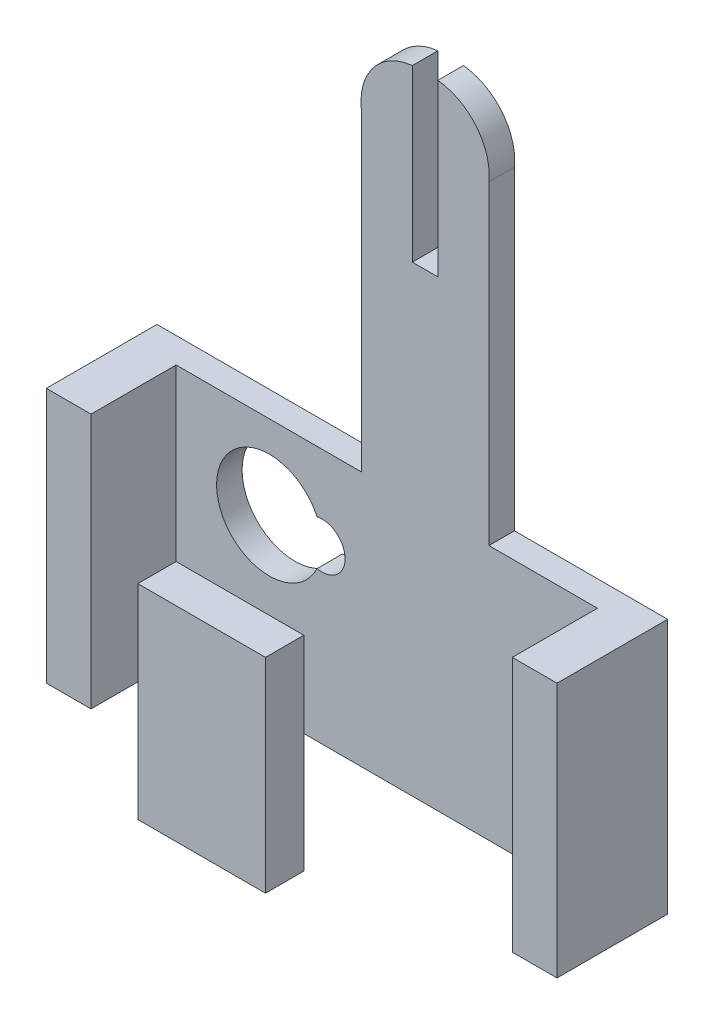
ISO-10303-21;
HEADER;
FILE_DESCRIPTION(('STEP AP214'),'2;1');
FILE_NAME('part.step','',(''),(''),'','','');
FILE_SCHEMA(('AUTOMOTIVE_DESIGN { 1 0 10303 214 1 1 1 1 }'));
ENDSEC;
DATA;
#1=APPLICATION_CONTEXT('core data for automotive mechanical design processes');
#2=APPLICATION_PROTOCOL_DEFINITION('international standard','automotive_design',2000,#1);
#3=PRODUCT_CONTEXT('',#1,'mechanical');
#4=PRODUCT('Part','Part','',(#3));
#5=PRODUCT_RELATED_PRODUCT_CATEGORY('part','',(#4));
#6=PRODUCT_DEFINITION_FORMATION('','',#4);
#7=PRODUCT_DEFINITION_CONTEXT('part definition',#1,'design');
#8=PRODUCT_DEFINITION('design','',#6,#7);
#9=PRODUCT_DEFINITION_SHAPE('','',#8);
#10=(LENGTH_UNIT() NAMED_UNIT(*) SI_UNIT(.MILLI.,.METRE.));
#11=(NAMED_UNIT(*) PLANE_ANGLE_UNIT() SI_UNIT($,.RADIAN.));
#12=(NAMED_UNIT(*) SI_UNIT($,.STERADIAN.) SOLID_ANGLE_UNIT());
#13=UNCERTAINTY_MEASURE_WITH_UNIT(LENGTH_MEASURE(1.E-05),#10,'distance_accuracy_value','');
#14=(GEOMETRIC_REPRESENTATION_CONTEXT(3) GLOBAL_UNCERTAINTY_ASSIGNED_CONTEXT((#13)) GLOBAL_UNIT_ASSIGNED_CONTEXT((#10,
#11,#12)) REPRESENTATION_CONTEXT('',''));
#15=CARTESIAN_POINT('',(0.,0.,0.));
#16=DIRECTION('',(0.,0.,1.));
#17=DIRECTION('',(1.,0.,0.));
#18=AXIS2_PLACEMENT_3D('',#15,#16,#17);
#19=CARTESIAN_POINT('',(0.830000000000001,13.33,3.));
#20=DIRECTION('',(0.,0.,-1.));
#21=DIRECTION('',(-1.,0.,0.));
#22=AXIS2_PLACEMENT_3D('',#19,#20,#21);
#23=PLANE('',#22);
#24=CARTESIAN_POINT('',(-12.1,-34.14,3.));
#25=DIRECTION('',(0.,0.,1.));
#26=DIRECTION('',(1.,0.,0.));
#27=AXIS2_PLACEMENT_3D('',#24,#25,#26);
#28=CIRCLE('',#27,2.7);
#29=CARTESIAN_POINT('',(-12.6879032258064,-36.7752172200952,3.));
#30=VERTEX_POINT('',#29);
#31=CARTESIAN_POINT('',(-12.6879032258064,-31.5047827799048,3.));
#32=VERTEX_POINT('',#31);
#33=EDGE_CURVE('E254',#30,#32,#28,.T.);
#34=ORIENTED_EDGE('',*,*,#33,.F.);
#35=CARTESIAN_POINT('',(-18.3,-34.14,3.));
#36=DIRECTION('',(0.,0.,1.));
#37=DIRECTION('',(1.,0.,0.));
#38=AXIS2_PLACEMENT_3D('',#35,#36,#37);
#39=CIRCLE('',#38,6.2);
#40=EDGE_CURVE('E257',#32,#30,#39,.T.);
#41=ORIENTED_EDGE('',*,*,#40,.F.);
#42=EDGE_LOOP('',(#34,#41));
#43=FACE_BOUND('',#42,.T.);
#44=DIRECTION('',(0.,1.,0.));
#45=VECTOR('',#44,1.);
#46=CARTESIAN_POINT('',(-14.25,-44.34,3.));
#47=LINE('',#46,#45);
#48=CARTESIAN_POINT('',(-14.25,-54.34,3.));
#49=VERTEX_POINT('',#48);
#50=CARTESIAN_POINT('',(-14.25,-44.34,3.));
#51=VERTEX_POINT('',#50);
#52=EDGE_CURVE('E52',#49,#51,#47,.T.);
#53=ORIENTED_EDGE('',*,*,#52,.F.);
#54=DIRECTION('',(1.,0.,0.));
#55=VECTOR('',#54,1.);
#56=CARTESIAN_POINT('',(-34.5,-54.34,3.));
#57=LINE('',#56,#55);
#58=CARTESIAN_POINT('',(20.25,-54.34,3.));
#59=VERTEX_POINT('',#58);
#60=EDGE_CURVE('E278',#49,#59,#57,.T.);
#61=ORIENTED_EDGE('',*,*,#60,.T.);
#62=DIRECTION('',(0.,-1.,0.));
#63=VECTOR('',#62,1.);
#64=CARTESIAN_POINT('',(20.25,-24.34,3.));
#65=LINE('',#64,#63);
#66=CARTESIAN_POINT('',(20.25,-24.34,3.));
#67=VERTEX_POINT('',#66);
#68=EDGE_CURVE('E211',#67,#59,#65,.T.);
#69=ORIENTED_EDGE('',*,*,#68,.F.);
#70=DIRECTION('',(-1.,0.,0.));
#71=VECTOR('',#70,1.);
#72=CARTESIAN_POINT('',(25.5,-24.34,3.));
#73=LINE('',#72,#71);
#74=CARTESIAN_POINT('',(7.5,-24.34,3.));
#75=VERTEX_POINT('',#74);
#76=EDGE_CURVE('E282',#67,#75,#73,.T.);
#77=ORIENTED_EDGE('',*,*,#76,.T.);
#78=DIRECTION('',(0.,1.,0.));
#79=VECTOR('',#78,1.);
#80=CARTESIAN_POINT('',(7.5,0.,3.));
#81=LINE('',#80,#79);
#82=CARTESIAN_POINT('',(7.5,12.66,3.));
#83=VERTEX_POINT('',#82);
#84=EDGE_CURVE('E284',#75,#83,#81,.T.);
#85=ORIENTED_EDGE('',*,*,#84,.T.);
#86=CARTESIAN_POINT('',(0.830000000000001,13.33,3.));
#87=DIRECTION('',(0.,0.,1.));
#88=DIRECTION('',(-1.,0.,0.));
#89=AXIS2_PLACEMENT_3D('',#86,#87,#88);
#90=CIRCLE('',#89,6.70356621508283);
#91=CARTESIAN_POINT('',(1.5,20.,3.));
#92=VERTEX_POINT('',#91);
#93=EDGE_CURVE('E286',#83,#92,#90,.T.);
#94=ORIENTED_EDGE('',*,*,#93,.T.);
#95=DIRECTION('',(0.,-1.,0.));
#96=VECTOR('',#95,1.);
#97=CARTESIAN_POINT('',(1.5,0.,3.));
#98=LINE('',#97,#96);
#99=CARTESIAN_POINT('',(1.5,0.,3.));
#100=VERTEX_POINT('',#99);
#101=EDGE_CURVE('E288',#92,#100,#98,.T.);
#102=ORIENTED_EDGE('',*,*,#101,.T.);
#103=DIRECTION('',(-1.,0.,0.));
#104=VECTOR('',#103,1.);
#105=CARTESIAN_POINT('',(1.5,0.,3.));
#106=LINE('',#105,#104);
#107=CARTESIAN_POINT('',(-1.5,0.,3.));
#108=VERTEX_POINT('',#107);
#109=EDGE_CURVE('E290',#100,#108,#106,.T.);
#110=ORIENTED_EDGE('',*,*,#109,.T.);
#111=DIRECTION('',(0.,1.,0.));
#112=VECTOR('',#111,1.);
#113=CARTESIAN_POINT('',(-1.5,0.,3.));
#114=LINE('',#113,#112);
#115=CARTESIAN_POINT('',(-1.5,20.,3.));
#116=VERTEX_POINT('',#115);
#117=EDGE_CURVE('E292',#108,#116,#114,.T.);
#118=ORIENTED_EDGE('',*,*,#117,.T.);
#119=CARTESIAN_POINT('',(-0.829999999999978,13.33,3.));
#120=DIRECTION('',(0.,0.,1.));
#121=DIRECTION('',(-1.,0.,0.));
#122=AXIS2_PLACEMENT_3D('',#119,#120,#121);
#123=CIRCLE('',#122,6.70356621508285);
#124=CARTESIAN_POINT('',(-7.5,12.66,3.));
#125=VERTEX_POINT('',#124);
#126=EDGE_CURVE('E294',#116,#125,#123,.T.);
#127=ORIENTED_EDGE('',*,*,#126,.T.);
#128=DIRECTION('',(0.,-1.,0.));
#129=VECTOR('',#128,1.);
#130=CARTESIAN_POINT('',(-7.5,0.,3.));
#131=LINE('',#130,#129);
#132=CARTESIAN_POINT('',(-7.5,-24.34,3.));
#133=VERTEX_POINT('',#132);
#134=EDGE_CURVE('E271',#125,#133,#131,.T.);
#135=ORIENTED_EDGE('',*,*,#134,.T.);
#136=DIRECTION('',(-1.,0.,0.));
#137=VECTOR('',#136,1.);
#138=CARTESIAN_POINT('',(-7.5,-24.34,3.));
#139=LINE('',#138,#137);
#140=CARTESIAN_POINT('',(-29.25,-24.34,3.));
#141=VERTEX_POINT('',#140);
#142=EDGE_CURVE('E274',#133,#141,#139,.T.);
#143=ORIENTED_EDGE('',*,*,#142,.T.);
#144=DIRECTION('',(0.,1.,0.));
#145=VECTOR('',#144,1.);
#146=CARTESIAN_POINT('',(-29.25,-54.34,3.));
#147=LINE('',#146,#145);
#148=CARTESIAN_POINT('',(-29.25,-44.34,3.));
#149=VERTEX_POINT('',#148);
#150=EDGE_CURVE('E235',#149,#141,#147,.T.);
#151=ORIENTED_EDGE('',*,*,#150,.F.);
#152=DIRECTION('',(-1.,0.,0.));
#153=VECTOR('',#152,1.);
#154=CARTESIAN_POINT('',(-29.25,-44.34,3.));
#155=LINE('',#154,#153);
#156=EDGE_CURVE('E48',#51,#149,#155,.T.);
#157=ORIENTED_EDGE('',*,*,#156,.F.);
#158=EDGE_LOOP('',(#53,#61,#69,#77,#85,#94,#102,#110,#118,#127,#135,#143,#151,#157));
#159=FACE_BOUND('',#158,.T.);
#160=ADVANCED_FACE('F33',(#43,#159),#23,.F.);
#161=CARTESIAN_POINT('',(-29.25,-54.34,13.));
#162=DIRECTION('',(-1.,0.,0.));
#163=DIRECTION('',(0.,0.,1.));
#164=AXIS2_PLACEMENT_3D('',#161,#162,#163);
#165=PLANE('',#164);
#166=DIRECTION('',(0.,0.,-1.));
#167=VECTOR('',#166,1.);
#168=CARTESIAN_POINT('',(-29.25,-44.34,7.5));
#169=LINE('',#168,#167);
#170=CARTESIAN_POINT('',(-29.25,-44.34,7.5));
#171=VERTEX_POINT('',#170);
#172=EDGE_CURVE('E422',#171,#149,#169,.T.);
#173=ORIENTED_EDGE('',*,*,#172,.T.);
#174=ORIENTED_EDGE('',*,*,#150,.T.);
#175=DIRECTION('',(0.,0.,-1.));
#176=VECTOR('',#175,1.);
#177=CARTESIAN_POINT('',(-29.25,-24.34,13.));
#178=LINE('',#177,#176);
#179=CARTESIAN_POINT('',(-29.25,-24.34,13.));
#180=VERTEX_POINT('',#179);
#181=EDGE_CURVE('E246',#180,#141,#178,.T.);
#182=ORIENTED_EDGE('',*,*,#181,.F.);
#183=DIRECTION('',(0.,1.,0.));
#184=VECTOR('',#183,1.);
#185=CARTESIAN_POINT('',(-29.25,-54.34,13.));
#186=LINE('',#185,#184);
#187=CARTESIAN_POINT('',(-29.25,-54.34,13.));
#188=VERTEX_POINT('',#187);
#189=EDGE_CURVE('E244',#188,#180,#186,.T.);
#190=ORIENTED_EDGE('',*,*,#189,.F.);
#191=DIRECTION('',(0.,0.,-1.));
#192=VECTOR('',#191,1.);
#193=CARTESIAN_POINT('',(-29.25,-54.34,13.));
#194=LINE('',#193,#192);
#195=CARTESIAN_POINT('',(-29.25,-54.34,7.5));
#196=VERTEX_POINT('',#195);
#197=EDGE_CURVE('E251',#188,#196,#194,.T.);
#198=ORIENTED_EDGE('',*,*,#197,.T.);
#199=DIRECTION('',(0.,-1.,0.));
#200=VECTOR('',#199,1.);
#201=CARTESIAN_POINT('',(-29.25,-68.34,7.5));
#202=LINE('',#201,#200);
#203=EDGE_CURVE('E193',#171,#196,#202,.T.);
#204=ORIENTED_EDGE('',*,*,#203,.F.);
#205=EDGE_LOOP('',(#173,#174,#182,#190,#198,#204));
#206=FACE_BOUND('',#205,.T.);
#207=ADVANCED_FACE('F443',(#206),#165,.F.);
#208=CARTESIAN_POINT('',(0.830000000000001,13.33,0.));
#209=DIRECTION('',(0.,0.,-1.));
#210=DIRECTION('',(-1.,0.,0.));
#211=AXIS2_PLACEMENT_3D('',#208,#209,#210);
#212=PLANE('',#211);
#213=DIRECTION('',(-1.,0.,0.));
#214=VECTOR('',#213,1.);
#215=CARTESIAN_POINT('',(-7.5,-24.34,0.));
#216=LINE('',#215,#214);
#217=CARTESIAN_POINT('',(-7.5,-24.34,0.));
#218=VERTEX_POINT('',#217);
#219=CARTESIAN_POINT('',(-34.5,-24.34,0.));
#220=VERTEX_POINT('',#219);
#221=EDGE_CURVE('E270',#218,#220,#216,.T.);
#222=ORIENTED_EDGE('',*,*,#221,.F.);
#223=DIRECTION('',(0.,-1.,0.));
#224=VECTOR('',#223,1.);
#225=CARTESIAN_POINT('',(-7.5,0.,0.));
#226=LINE('',#225,#224);
#227=CARTESIAN_POINT('',(-7.5,12.66,0.));
#228=VERTEX_POINT('',#227);
#229=EDGE_CURVE('E275',#228,#218,#226,.T.);
#230=ORIENTED_EDGE('',*,*,#229,.F.);
#231=CARTESIAN_POINT('',(-0.829999999999978,13.33,0.));
#232=DIRECTION('',(0.,0.,1.));
#233=DIRECTION('',(-1.,0.,0.));
#234=AXIS2_PLACEMENT_3D('',#231,#232,#233);
#235=CIRCLE('',#234,6.70356621508285);
#236=CARTESIAN_POINT('',(-1.5,20.,0.));
#237=VERTEX_POINT('',#236);
#238=EDGE_CURVE('E318',#237,#228,#235,.T.);
#239=ORIENTED_EDGE('',*,*,#238,.F.);
#240=DIRECTION('',(0.,1.,0.));
#241=VECTOR('',#240,1.);
#242=CARTESIAN_POINT('',(-1.5,0.,0.));
#243=LINE('',#242,#241);
#244=CARTESIAN_POINT('',(-1.5,0.,0.));
#245=VERTEX_POINT('',#244);
#246=EDGE_CURVE('E316',#245,#237,#243,.T.);
#247=ORIENTED_EDGE('',*,*,#246,.F.);
#248=DIRECTION('',(-1.,0.,0.));
#249=VECTOR('',#248,1.);
#250=CARTESIAN_POINT('',(1.5,0.,0.));
#251=LINE('',#250,#249);
#252=CARTESIAN_POINT('',(1.5,0.,0.));
#253=VERTEX_POINT('',#252);
#254=EDGE_CURVE('E314',#253,#245,#251,.T.);
#255=ORIENTED_EDGE('',*,*,#254,.F.);
#256=DIRECTION('',(0.,-1.,0.));
#257=VECTOR('',#256,1.);
#258=CARTESIAN_POINT('',(1.5,0.,0.));
#259=LINE('',#258,#257);
#260=CARTESIAN_POINT('',(1.5,20.,0.));
#261=VERTEX_POINT('',#260);
#262=EDGE_CURVE('E312',#261,#253,#259,.T.);
#263=ORIENTED_EDGE('',*,*,#262,.F.);
#264=CARTESIAN_POINT('',(0.830000000000001,13.33,0.));
#265=DIRECTION('',(0.,0.,1.));
#266=DIRECTION('',(-1.,0.,0.));
#267=AXIS2_PLACEMENT_3D('',#264,#265,#266);
#268=CIRCLE('',#267,6.70356621508283);
#269=CARTESIAN_POINT('',(7.5,12.66,0.));
#270=VERTEX_POINT('',#269);
#271=EDGE_CURVE('E310',#270,#261,#268,.T.);
#272=ORIENTED_EDGE('',*,*,#271,.F.);
#273=DIRECTION('',(0.,1.,0.));
#274=VECTOR('',#273,1.);
#275=CARTESIAN_POINT('',(7.5,0.,0.));
#276=LINE('',#275,#274);
#277=CARTESIAN_POINT('',(7.5,-24.34,0.));
#278=VERTEX_POINT('',#277);
#279=EDGE_CURVE('E308',#278,#270,#276,.T.);
#280=ORIENTED_EDGE('',*,*,#279,.F.);
#281=DIRECTION('',(-1.,0.,0.));
#282=VECTOR('',#281,1.);
#283=CARTESIAN_POINT('',(25.5,-24.34,0.));
#284=LINE('',#283,#282);
#285=CARTESIAN_POINT('',(25.5,-24.34,0.));
#286=VERTEX_POINT('',#285);
#287=EDGE_CURVE('E305',#286,#278,#284,.T.);
#288=ORIENTED_EDGE('',*,*,#287,.F.);
#289=DIRECTION('',(0.,1.,0.));
#290=VECTOR('',#289,1.);
#291=CARTESIAN_POINT('',(25.5,-54.34,0.));
#292=LINE('',#291,#290);
#293=CARTESIAN_POINT('',(25.5,-54.34,0.));
#294=VERTEX_POINT('',#293);
#295=EDGE_CURVE('E303',#294,#286,#292,.T.);
#296=ORIENTED_EDGE('',*,*,#295,.F.);
#297=DIRECTION('',(1.,0.,0.));
#298=VECTOR('',#297,1.);
#299=CARTESIAN_POINT('',(-34.5,-54.34,0.));
#300=LINE('',#299,#298);
#301=CARTESIAN_POINT('',(-34.5,-54.34,0.));
#302=VERTEX_POINT('',#301);
#303=EDGE_CURVE('E301',#302,#294,#300,.T.);
#304=ORIENTED_EDGE('',*,*,#303,.F.);
#305=DIRECTION('',(0.,-1.,0.));
#306=VECTOR('',#305,1.);
#307=CARTESIAN_POINT('',(-34.5,-24.34,0.));
#308=LINE('',#307,#306);
#309=EDGE_CURVE('E299',#220,#302,#308,.T.);
#310=ORIENTED_EDGE('',*,*,#309,.F.);
#311=EDGE_LOOP('',(#222,#230,#239,#247,#255,#263,#272,#280,#288,#296,#304,#310));
#312=FACE_BOUND('',#311,.T.);
#313=CARTESIAN_POINT('',(-18.3,-34.14,0.));
#314=DIRECTION('',(0.,0.,1.));
#315=DIRECTION('',(1.,0.,0.));
#316=AXIS2_PLACEMENT_3D('',#313,#314,#315);
#317=CIRCLE('',#316,6.2);
#318=CARTESIAN_POINT('',(-12.6879032258064,-31.5047827799048,0.));
#319=VERTEX_POINT('',#318);
#320=CARTESIAN_POINT('',(-12.6879032258064,-36.7752172200952,0.));
#321=VERTEX_POINT('',#320);
#322=EDGE_CURVE('E258',#319,#321,#317,.T.);
#323=ORIENTED_EDGE('',*,*,#322,.T.);
#324=CARTESIAN_POINT('',(-12.1,-34.14,0.));
#325=DIRECTION('',(0.,0.,1.));
#326=DIRECTION('',(1.,0.,0.));
#327=AXIS2_PLACEMENT_3D('',#324,#325,#326);
#328=CIRCLE('',#327,2.7);
#329=EDGE_CURVE('E253',#321,#319,#328,.T.);
#330=ORIENTED_EDGE('',*,*,#329,.T.);
#331=EDGE_LOOP('',(#323,#330));
#332=FACE_BOUND('',#331,.T.);
#333=ADVANCED_FACE('F359',(#312,#332),#212,.T.);
#334=CARTESIAN_POINT('',(-7.5,-24.34,3.));
#335=DIRECTION('',(0.,-1.,0.));
#336=DIRECTION('',(1.,0.,0.));
#337=AXIS2_PLACEMENT_3D('',#334,#335,#336);
#338=PLANE('',#337);
#339=ORIENTED_EDGE('',*,*,#221,.T.);
#340=DIRECTION('',(0.,0.,-1.));
#341=VECTOR('',#340,1.);
#342=CARTESIAN_POINT('',(-34.5,-24.34,3.));
#343=LINE('',#342,#341);
#344=CARTESIAN_POINT('',(-34.5,-24.34,13.));
#345=VERTEX_POINT('',#344);
#346=EDGE_CURVE('E41',#345,#220,#343,.T.);
#347=ORIENTED_EDGE('',*,*,#346,.F.);
#348=DIRECTION('',(-1.,0.,0.));
#349=VECTOR('',#348,1.);
#350=CARTESIAN_POINT('',(-29.25,-24.34,13.));
#351=LINE('',#350,#349);
#352=EDGE_CURVE('E236',#180,#345,#351,.T.);
#353=ORIENTED_EDGE('',*,*,#352,.F.);
#354=ORIENTED_EDGE('',*,*,#181,.T.);
#355=ORIENTED_EDGE('',*,*,#142,.F.);
#356=DIRECTION('',(0.,0.,-1.));
#357=VECTOR('',#356,1.);
#358=CARTESIAN_POINT('',(-7.5,-24.34,3.));
#359=LINE('',#358,#357);
#360=EDGE_CURVE('E11',#133,#218,#359,.T.);
#361=ORIENTED_EDGE('',*,*,#360,.T.);
#362=EDGE_LOOP('',(#339,#347,#353,#354,#355,#361));
#363=FACE_BOUND('',#362,.T.);
#364=ADVANCED_FACE('F35',(#363),#338,.F.);
#365=CARTESIAN_POINT('',(-34.5,-24.34,3.));
#366=DIRECTION('',(1.,0.,0.));
#367=DIRECTION('',(0.,1.,0.));
#368=AXIS2_PLACEMENT_3D('',#365,#366,#367);
#369=PLANE('',#368);
#370=ORIENTED_EDGE('',*,*,#309,.T.);
#371=DIRECTION('',(0.,0.,-1.));
#372=VECTOR('',#371,1.);
#373=CARTESIAN_POINT('',(-34.5,-54.34,3.));
#374=LINE('',#373,#372);
#375=CARTESIAN_POINT('',(-34.5,-54.34,13.));
#376=VERTEX_POINT('',#375);
#377=EDGE_CURVE('E347',#376,#302,#374,.T.);
#378=ORIENTED_EDGE('',*,*,#377,.F.);
#379=DIRECTION('',(0.,-1.,0.));
#380=VECTOR('',#379,1.);
#381=CARTESIAN_POINT('',(-34.5,-24.34,13.));
#382=LINE('',#381,#380);
#383=EDGE_CURVE('E239',#345,#376,#382,.T.);
#384=ORIENTED_EDGE('',*,*,#383,.F.);
#385=ORIENTED_EDGE('',*,*,#346,.T.);
#386=EDGE_LOOP('',(#370,#378,#384,#385));
#387=FACE_BOUND('',#386,.T.);
#388=ADVANCED_FACE('F353',(#387),#369,.F.);
#389=CARTESIAN_POINT('',(-34.5,-54.34,3.));
#390=DIRECTION('',(0.,1.,0.));
#391=DIRECTION('',(-1.,0.,0.));
#392=AXIS2_PLACEMENT_3D('',#389,#390,#391);
#393=PLANE('',#392);
#394=ORIENTED_EDGE('',*,*,#303,.T.);
#395=DIRECTION('',(0.,0.,-1.));
#396=VECTOR('',#395,1.);
#397=CARTESIAN_POINT('',(25.5,-54.34,3.));
#398=LINE('',#397,#396);
#399=CARTESIAN_POINT('',(25.5,-54.34,13.));
#400=VERTEX_POINT('',#399);
#401=EDGE_CURVE('E344',#400,#294,#398,.T.);
#402=ORIENTED_EDGE('',*,*,#401,.F.);
#403=DIRECTION('',(1.,0.,0.));
#404=VECTOR('',#403,1.);
#405=CARTESIAN_POINT('',(20.25,-54.34,13.));
#406=LINE('',#405,#404);
#407=CARTESIAN_POINT('',(20.25,-54.34,13.));
#408=VERTEX_POINT('',#407);
#409=EDGE_CURVE('E226',#408,#400,#406,.T.);
#410=ORIENTED_EDGE('',*,*,#409,.F.);
#411=DIRECTION('',(0.,0.,-1.));
#412=VECTOR('',#411,1.);
#413=CARTESIAN_POINT('',(20.25,-54.34,13.));
#414=LINE('',#413,#412);
#415=EDGE_CURVE('E228',#408,#59,#414,.T.);
#416=ORIENTED_EDGE('',*,*,#415,.T.);
#417=ORIENTED_EDGE('',*,*,#60,.F.);
#418=CARTESIAN_POINT('',(-29.25,-54.34,3.));
#419=VERTEX_POINT('',#418);
#420=EDGE_CURVE('E279',#419,#49,#57,.T.);
#421=ORIENTED_EDGE('',*,*,#420,.F.);
#422=EDGE_CURVE('E250',#196,#419,#194,.T.);
#423=ORIENTED_EDGE('',*,*,#422,.F.);
#424=ORIENTED_EDGE('',*,*,#197,.F.);
#425=DIRECTION('',(1.,0.,0.));
#426=VECTOR('',#425,1.);
#427=CARTESIAN_POINT('',(-34.5,-54.34,13.));
#428=LINE('',#427,#426);
#429=EDGE_CURVE('E242',#376,#188,#428,.T.);
#430=ORIENTED_EDGE('',*,*,#429,.F.);
#431=ORIENTED_EDGE('',*,*,#377,.T.);
#432=EDGE_LOOP('',(#394,#402,#410,#416,#417,#421,#423,#424,#430,#431));
#433=FACE_BOUND('',#432,.T.);
#434=ADVANCED_FACE('F365',(#433),#393,.F.);
#435=CARTESIAN_POINT('',(25.5,-54.34,3.));
#436=DIRECTION('',(-1.,0.,0.));
#437=DIRECTION('',(0.,0.,1.));
#438=AXIS2_PLACEMENT_3D('',#435,#436,#437);
#439=PLANE('',#438);
#440=ORIENTED_EDGE('',*,*,#295,.T.);
#441=DIRECTION('',(0.,0.,-1.));
#442=VECTOR('',#441,1.);
#443=CARTESIAN_POINT('',(25.5,-24.34,3.));
#444=LINE('',#443,#442);
#445=CARTESIAN_POINT('',(25.5,-24.34,13.));
#446=VERTEX_POINT('',#445);
#447=EDGE_CURVE('E341',#446,#286,#444,.T.);
#448=ORIENTED_EDGE('',*,*,#447,.F.);
#449=DIRECTION('',(0.,1.,0.));
#450=VECTOR('',#449,1.);
#451=CARTESIAN_POINT('',(25.5,-54.34,13.));
#452=LINE('',#451,#450);
#453=EDGE_CURVE('E214',#400,#446,#452,.T.);
#454=ORIENTED_EDGE('',*,*,#453,.F.);
#455=ORIENTED_EDGE('',*,*,#401,.T.);
#456=EDGE_LOOP('',(#440,#448,#454,#455));
#457=FACE_BOUND('',#456,.T.);
#458=ADVANCED_FACE('F370',(#457),#439,.F.);
#459=CARTESIAN_POINT('',(25.5,-24.34,3.));
#460=DIRECTION('',(0.,-1.,0.));
#461=DIRECTION('',(1.,0.,0.));
#462=AXIS2_PLACEMENT_3D('',#459,#460,#461);
#463=PLANE('',#462);
#464=ORIENTED_EDGE('',*,*,#287,.T.);
#465=DIRECTION('',(0.,0.,-1.));
#466=VECTOR('',#465,1.);
#467=CARTESIAN_POINT('',(7.5,-24.34,3.));
#468=LINE('',#467,#466);
#469=EDGE_CURVE('E338',#75,#278,#468,.T.);
#470=ORIENTED_EDGE('',*,*,#469,.F.);
#471=ORIENTED_EDGE('',*,*,#76,.F.);
#472=DIRECTION('',(0.,0.,-1.));
#473=VECTOR('',#472,1.);
#474=CARTESIAN_POINT('',(20.25,-24.34,13.));
#475=LINE('',#474,#473);
#476=CARTESIAN_POINT('',(20.25,-24.34,13.));
#477=VERTEX_POINT('',#476);
#478=EDGE_CURVE('E232',#477,#67,#475,.T.);
#479=ORIENTED_EDGE('',*,*,#478,.F.);
#480=DIRECTION('',(-1.,0.,0.));
#481=VECTOR('',#480,1.);
#482=CARTESIAN_POINT('',(25.5,-24.34,13.));
#483=LINE('',#482,#481);
#484=EDGE_CURVE('E222',#446,#477,#483,.T.);
#485=ORIENTED_EDGE('',*,*,#484,.F.);
#486=ORIENTED_EDGE('',*,*,#447,.T.);
#487=EDGE_LOOP('',(#464,#470,#471,#479,#485,#486));
#488=FACE_BOUND('',#487,.T.);
#489=ADVANCED_FACE('F384',(#488),#463,.F.);
#490=CARTESIAN_POINT('',(7.5,0.,3.));
#491=DIRECTION('',(-1.,0.,0.));
#492=DIRECTION('',(0.,0.,1.));
#493=AXIS2_PLACEMENT_3D('',#490,#491,#492);
#494=PLANE('',#493);
#495=ORIENTED_EDGE('',*,*,#279,.T.);
#496=DIRECTION('',(0.,0.,-1.));
#497=VECTOR('',#496,1.);
#498=CARTESIAN_POINT('',(7.5,12.66,3.));
#499=LINE('',#498,#497);
#500=EDGE_CURVE('E335',#83,#270,#499,.T.);
#501=ORIENTED_EDGE('',*,*,#500,.F.);
#502=ORIENTED_EDGE('',*,*,#84,.F.);
#503=ORIENTED_EDGE('',*,*,#469,.T.);
#504=EDGE_LOOP('',(#495,#501,#502,#503));
#505=FACE_BOUND('',#504,.T.);
#506=ADVANCED_FACE('F386',(#505),#494,.F.);
#507=CARTESIAN_POINT('',(0.830000000000001,13.33,3.));
#508=DIRECTION('',(0.,0.,-1.));
#509=DIRECTION('',(-1.,0.,0.));
#510=AXIS2_PLACEMENT_3D('',#507,#508,#509);
#511=CYLINDRICAL_SURFACE('',#510,6.70356621508283);
#512=ORIENTED_EDGE('',*,*,#271,.T.);
#513=DIRECTION('',(0.,0.,-1.));
#514=VECTOR('',#513,1.);
#515=CARTESIAN_POINT('',(1.5,20.,3.));
#516=LINE('',#515,#514);
#517=EDGE_CURVE('E332',#92,#261,#516,.T.);
#518=ORIENTED_EDGE('',*,*,#517,.F.);
#519=ORIENTED_EDGE('',*,*,#93,.F.);
#520=ORIENTED_EDGE('',*,*,#500,.T.);
#521=EDGE_LOOP('',(#512,#518,#519,#520));
#522=FACE_BOUND('',#521,.T.);
#523=ADVANCED_FACE('F391',(#522),#511,.T.);
#524=CARTESIAN_POINT('',(1.5,0.,3.));
#525=DIRECTION('',(1.,0.,0.));
#526=DIRECTION('',(0.,0.,-1.));
#527=AXIS2_PLACEMENT_3D('',#524,#525,#526);
#528=PLANE('',#527);
#529=ORIENTED_EDGE('',*,*,#262,.T.);
#530=DIRECTION('',(0.,0.,-1.));
#531=VECTOR('',#530,1.);
#532=CARTESIAN_POINT('',(1.5,0.,3.));
#533=LINE('',#532,#531);
#534=EDGE_CURVE('E329',#100,#253,#533,.T.);
#535=ORIENTED_EDGE('',*,*,#534,.F.);
#536=ORIENTED_EDGE('',*,*,#101,.F.);
#537=ORIENTED_EDGE('',*,*,#517,.T.);
#538=EDGE_LOOP('',(#529,#535,#536,#537));
#539=FACE_BOUND('',#538,.T.);
#540=ADVANCED_FACE('F397',(#539),#528,.F.);
#541=CARTESIAN_POINT('',(1.5,0.,3.));
#542=DIRECTION('',(0.,-1.,0.));
#543=DIRECTION('',(0.,0.,-1.));
#544=AXIS2_PLACEMENT_3D('',#541,#542,#543);
#545=PLANE('',#544);
#546=ORIENTED_EDGE('',*,*,#254,.T.);
#547=DIRECTION('',(0.,0.,-1.));
#548=VECTOR('',#547,1.);
#549=CARTESIAN_POINT('',(-1.5,0.,3.));
#550=LINE('',#549,#548);
#551=EDGE_CURVE('E326',#108,#245,#550,.T.);
#552=ORIENTED_EDGE('',*,*,#551,.F.);
#553=ORIENTED_EDGE('',*,*,#109,.F.);
#554=ORIENTED_EDGE('',*,*,#534,.T.);
#555=EDGE_LOOP('',(#546,#552,#553,#554));
#556=FACE_BOUND('',#555,.T.);
#557=ADVANCED_FACE('F401',(#556),#545,.F.);
#558=CARTESIAN_POINT('',(-1.5,0.,3.));
#559=DIRECTION('',(-1.,0.,0.));
#560=DIRECTION('',(0.,0.,1.));
#561=AXIS2_PLACEMENT_3D('',#558,#559,#560);
#562=PLANE('',#561);
#563=ORIENTED_EDGE('',*,*,#246,.T.);
#564=DIRECTION('',(0.,0.,-1.));
#565=VECTOR('',#564,1.);
#566=CARTESIAN_POINT('',(-1.5,20.,3.));
#567=LINE('',#566,#565);
#568=EDGE_CURVE('E323',#116,#237,#567,.T.);
#569=ORIENTED_EDGE('',*,*,#568,.F.);
#570=ORIENTED_EDGE('',*,*,#117,.F.);
#571=ORIENTED_EDGE('',*,*,#551,.T.);
#572=EDGE_LOOP('',(#563,#569,#570,#571));
#573=FACE_BOUND('',#572,.T.);
#574=ADVANCED_FACE('F406',(#573),#562,.F.);
#575=CARTESIAN_POINT('',(-0.829999999999978,13.33,3.));
#576=DIRECTION('',(0.,0.,-1.));
#577=DIRECTION('',(-1.,0.,0.));
#578=AXIS2_PLACEMENT_3D('',#575,#576,#577);
#579=CYLINDRICAL_SURFACE('',#578,6.70356621508285);
#580=ORIENTED_EDGE('',*,*,#238,.T.);
#581=DIRECTION('',(0.,0.,-1.));
#582=VECTOR('',#581,1.);
#583=CARTESIAN_POINT('',(-7.5,12.66,3.));
#584=LINE('',#583,#582);
#585=EDGE_CURVE('E297',#125,#228,#584,.T.);
#586=ORIENTED_EDGE('',*,*,#585,.F.);
#587=ORIENTED_EDGE('',*,*,#126,.F.);
#588=ORIENTED_EDGE('',*,*,#568,.T.);
#589=EDGE_LOOP('',(#580,#586,#587,#588));
#590=FACE_BOUND('',#589,.T.);
#591=ADVANCED_FACE('F411',(#590),#579,.T.);
#592=CARTESIAN_POINT('',(-7.5,0.,3.));
#593=DIRECTION('',(1.,0.,0.));
#594=DIRECTION('',(0.,0.,-1.));
#595=AXIS2_PLACEMENT_3D('',#592,#593,#594);
#596=PLANE('',#595);
#597=ORIENTED_EDGE('',*,*,#229,.T.);
#598=ORIENTED_EDGE('',*,*,#360,.F.);
#599=ORIENTED_EDGE('',*,*,#134,.F.);
#600=ORIENTED_EDGE('',*,*,#585,.T.);
#601=EDGE_LOOP('',(#597,#598,#599,#600));
#602=FACE_BOUND('',#601,.T.);
#603=ADVANCED_FACE('F414',(#602),#596,.F.);
#604=CARTESIAN_POINT('',(-12.1,-34.14,3.));
#605=DIRECTION('',(0.,0.,-1.));
#606=DIRECTION('',(-1.,0.,0.));
#607=AXIS2_PLACEMENT_3D('',#604,#605,#606);
#608=CYLINDRICAL_SURFACE('',#607,2.7);
#609=ORIENTED_EDGE('',*,*,#329,.F.);
#610=DIRECTION('',(0.,0.,-1.));
#611=VECTOR('',#610,1.);
#612=CARTESIAN_POINT('',(-12.6879032258064,-36.7752172200952,3.));
#613=LINE('',#612,#611);
#614=EDGE_CURVE('E260',#30,#321,#613,.T.);
#615=ORIENTED_EDGE('',*,*,#614,.F.);
#616=ORIENTED_EDGE('',*,*,#33,.T.);
#617=DIRECTION('',(0.,0.,-1.));
#618=VECTOR('',#617,1.);
#619=CARTESIAN_POINT('',(-12.6879032258064,-31.5047827799048,3.));
#620=LINE('',#619,#618);
#621=EDGE_CURVE('E267',#32,#319,#620,.T.);
#622=ORIENTED_EDGE('',*,*,#621,.T.);
#623=EDGE_LOOP('',(#609,#615,#616,#622));
#624=FACE_BOUND('',#623,.T.);
#625=ADVANCED_FACE('F454',(#624),#608,.F.);
#626=CARTESIAN_POINT('',(-18.3,-34.14,3.));
#627=DIRECTION('',(0.,0.,-1.));
#628=DIRECTION('',(-1.,0.,0.));
#629=AXIS2_PLACEMENT_3D('',#626,#627,#628);
#630=CYLINDRICAL_SURFACE('',#629,6.2);
#631=ORIENTED_EDGE('',*,*,#322,.F.);
#632=ORIENTED_EDGE('',*,*,#621,.F.);
#633=ORIENTED_EDGE('',*,*,#40,.T.);
#634=ORIENTED_EDGE('',*,*,#614,.T.);
#635=EDGE_LOOP('',(#631,#632,#633,#634));
#636=FACE_BOUND('',#635,.T.);
#637=ADVANCED_FACE('F447',(#636),#630,.F.);
#638=CARTESIAN_POINT('',(0.,0.,13.));
#639=DIRECTION('',(0.,0.,1.));
#640=DIRECTION('',(1.,0.,0.));
#641=AXIS2_PLACEMENT_3D('',#638,#639,#640);
#642=PLANE('',#641);
#643=ORIENTED_EDGE('',*,*,#352,.T.);
#644=ORIENTED_EDGE('',*,*,#383,.T.);
#645=ORIENTED_EDGE('',*,*,#429,.T.);
#646=ORIENTED_EDGE('',*,*,#189,.T.);
#647=EDGE_LOOP('',(#643,#644,#645,#646));
#648=FACE_BOUND('',#647,.T.);
#649=ADVANCED_FACE('F445',(#648),#642,.T.);
#650=CARTESIAN_POINT('',(20.25,-24.34,13.));
#651=DIRECTION('',(1.,0.,0.));
#652=DIRECTION('',(0.,1.,0.));
#653=AXIS2_PLACEMENT_3D('',#650,#651,#652);
#654=PLANE('',#653);
#655=ORIENTED_EDGE('',*,*,#68,.T.);
#656=ORIENTED_EDGE('',*,*,#415,.F.);
#657=DIRECTION('',(0.,-1.,0.));
#658=VECTOR('',#657,1.);
#659=CARTESIAN_POINT('',(20.25,-24.34,13.));
#660=LINE('',#659,#658);
#661=EDGE_CURVE('E224',#477,#408,#660,.T.);
#662=ORIENTED_EDGE('',*,*,#661,.F.);
#663=ORIENTED_EDGE('',*,*,#478,.T.);
#664=EDGE_LOOP('',(#655,#656,#662,#663));
#665=FACE_BOUND('',#664,.T.);
#666=ADVANCED_FACE('F378',(#665),#654,.F.);
#667=CARTESIAN_POINT('',(0.,0.,13.));
#668=DIRECTION('',(0.,0.,1.));
#669=DIRECTION('',(1.,0.,0.));
#670=AXIS2_PLACEMENT_3D('',#667,#668,#669);
#671=PLANE('',#670);
#672=ORIENTED_EDGE('',*,*,#453,.T.);
#673=ORIENTED_EDGE('',*,*,#484,.T.);
#674=ORIENTED_EDGE('',*,*,#661,.T.);
#675=ORIENTED_EDGE('',*,*,#409,.T.);
#676=EDGE_LOOP('',(#672,#673,#674,#675));
#677=FACE_BOUND('',#676,.T.);
#678=ADVANCED_FACE('F373',(#677),#671,.T.);
#679=CARTESIAN_POINT('',(-29.25,-54.34,7.5));
#680=DIRECTION('',(1.,0.,0.));
#681=DIRECTION('',(0.,0.,-1.));
#682=AXIS2_PLACEMENT_3D('',#679,#680,#681);
#683=PLANE('',#682);
#684=CARTESIAN_POINT('',(-29.25,-68.34,7.5));
#685=VERTEX_POINT('',#684);
#686=EDGE_CURVE('E187',#196,#685,#202,.T.);
#687=ORIENTED_EDGE('',*,*,#686,.F.);
#688=ORIENTED_EDGE('',*,*,#422,.T.);
#689=DIRECTION('',(0.,-1.,0.));
#690=VECTOR('',#689,1.);
#691=CARTESIAN_POINT('',(-29.25,-54.34,3.));
#692=LINE('',#691,#690);
#693=CARTESIAN_POINT('',(-29.25,-68.34,3.));
#694=VERTEX_POINT('',#693);
#695=EDGE_CURVE('E197',#419,#694,#692,.T.);
#696=ORIENTED_EDGE('',*,*,#695,.T.);
#697=DIRECTION('',(0.,0.,-1.));
#698=VECTOR('',#697,1.);
#699=CARTESIAN_POINT('',(-29.25,-68.34,7.5));
#700=LINE('',#699,#698);
#701=EDGE_CURVE('E202',#685,#694,#700,.T.);
#702=ORIENTED_EDGE('',*,*,#701,.F.);
#703=EDGE_LOOP('',(#687,#688,#696,#702));
#704=FACE_BOUND('',#703,.T.);
#705=ADVANCED_FACE('F208',(#704),#683,.F.);
#706=CARTESIAN_POINT('',(0.,0.,3.));
#707=DIRECTION('',(0.,0.,-1.));
#708=DIRECTION('',(-1.,0.,0.));
#709=AXIS2_PLACEMENT_3D('',#706,#707,#708);
#710=PLANE('',#709);
#711=ORIENTED_EDGE('',*,*,#420,.T.);
#712=CARTESIAN_POINT('',(-14.25,-68.34,3.));
#713=VERTEX_POINT('',#712);
#714=EDGE_CURVE('E424',#713,#49,#47,.T.);
#715=ORIENTED_EDGE('',*,*,#714,.F.);
#716=DIRECTION('',(1.,0.,0.));
#717=VECTOR('',#716,1.);
#718=CARTESIAN_POINT('',(-14.25,-68.34,3.));
#719=LINE('',#718,#717);
#720=EDGE_CURVE('E434',#694,#713,#719,.T.);
#721=ORIENTED_EDGE('',*,*,#720,.F.);
#722=ORIENTED_EDGE('',*,*,#695,.F.);
#723=EDGE_LOOP('',(#711,#715,#721,#722));
#724=FACE_BOUND('',#723,.T.);
#725=ADVANCED_FACE('F439',(#724),#710,.T.);
#726=CARTESIAN_POINT('',(-14.25,-68.34,7.5));
#727=DIRECTION('',(0.,1.,0.));
#728=DIRECTION('',(0.,0.,1.));
#729=AXIS2_PLACEMENT_3D('',#726,#727,#728);
#730=PLANE('',#729);
#731=ORIENTED_EDGE('',*,*,#720,.T.);
#732=DIRECTION('',(0.,0.,-1.));
#733=VECTOR('',#732,1.);
#734=CARTESIAN_POINT('',(-14.25,-68.34,7.5));
#735=LINE('',#734,#733);
#736=CARTESIAN_POINT('',(-14.25,-68.34,7.5));
#737=VERTEX_POINT('',#736);
#738=EDGE_CURVE('E204',#737,#713,#735,.T.);
#739=ORIENTED_EDGE('',*,*,#738,.F.);
#740=DIRECTION('',(1.,0.,0.));
#741=VECTOR('',#740,1.);
#742=CARTESIAN_POINT('',(-14.25,-68.34,7.5));
#743=LINE('',#742,#741);
#744=EDGE_CURVE('E190',#685,#737,#743,.T.);
#745=ORIENTED_EDGE('',*,*,#744,.F.);
#746=ORIENTED_EDGE('',*,*,#701,.T.);
#747=EDGE_LOOP('',(#731,#739,#745,#746));
#748=FACE_BOUND('',#747,.T.);
#749=ADVANCED_FACE('F201',(#748),#730,.F.);
#750=CARTESIAN_POINT('',(-14.25,-44.34,7.5));
#751=DIRECTION('',(-1.,0.,0.));
#752=DIRECTION('',(0.,-1.,0.));
#753=AXIS2_PLACEMENT_3D('',#750,#751,#752);
#754=PLANE('',#753);
#755=ORIENTED_EDGE('',*,*,#714,.T.);
#756=ORIENTED_EDGE('',*,*,#52,.T.);
#757=DIRECTION('',(0.,0.,-1.));
#758=VECTOR('',#757,1.);
#759=CARTESIAN_POINT('',(-14.25,-44.34,7.5));
#760=LINE('',#759,#758);
#761=CARTESIAN_POINT('',(-14.25,-44.34,7.5));
#762=VERTEX_POINT('',#761);
#763=EDGE_CURVE('E216',#762,#51,#760,.T.);
#764=ORIENTED_EDGE('',*,*,#763,.F.);
#765=DIRECTION('',(0.,1.,0.));
#766=VECTOR('',#765,1.);
#767=CARTESIAN_POINT('',(-14.25,-44.34,7.5));
#768=LINE('',#767,#766);
#769=EDGE_CURVE('E206',#737,#762,#768,.T.);
#770=ORIENTED_EDGE('',*,*,#769,.F.);
#771=ORIENTED_EDGE('',*,*,#738,.T.);
#772=EDGE_LOOP('',(#755,#756,#764,#770,#771));
#773=FACE_BOUND('',#772,.T.);
#774=ADVANCED_FACE('F436',(#773),#754,.F.);
#775=CARTESIAN_POINT('',(-29.25,-44.34,7.5));
#776=DIRECTION('',(0.,-1.,0.));
#777=DIRECTION('',(0.,0.,-1.));
#778=AXIS2_PLACEMENT_3D('',#775,#776,#777);
#779=PLANE('',#778);
#780=ORIENTED_EDGE('',*,*,#156,.T.);
#781=ORIENTED_EDGE('',*,*,#172,.F.);
#782=DIRECTION('',(-1.,0.,0.));
#783=VECTOR('',#782,1.);
#784=CARTESIAN_POINT('',(-29.25,-44.34,7.5));
#785=LINE('',#784,#783);
#786=EDGE_CURVE('E431',#762,#171,#785,.T.);
#787=ORIENTED_EDGE('',*,*,#786,.F.);
#788=ORIENTED_EDGE('',*,*,#763,.T.);
#789=EDGE_LOOP('',(#780,#781,#787,#788));
#790=FACE_BOUND('',#789,.T.);
#791=ADVANCED_FACE('F420',(#790),#779,.F.);
#792=CARTESIAN_POINT('',(0.,0.,7.5));
#793=DIRECTION('',(0.,0.,-1.));
#794=DIRECTION('',(-1.,0.,0.));
#795=AXIS2_PLACEMENT_3D('',#792,#793,#794);
#796=PLANE('',#795);
#797=ORIENTED_EDGE('',*,*,#203,.T.);
#798=ORIENTED_EDGE('',*,*,#686,.T.);
#799=ORIENTED_EDGE('',*,*,#744,.T.);
#800=ORIENTED_EDGE('',*,*,#769,.T.);
#801=ORIENTED_EDGE('',*,*,#786,.T.);
#802=EDGE_LOOP('',(#797,#798,#799,#800,#801));
#803=FACE_BOUND('',#802,.T.);
#804=ADVANCED_FACE('F189',(#803),#796,.F.);
#805=CLOSED_SHELL('',(#160,#207,#333,#364,#388,#434,#458,#489,#506,#523,#540,#557,#574,#591,
#603,#625,#637,#649,#666,#678,#705,#725,#749,#774,#791,#804));
#806=MANIFOLD_SOLID_BREP('B2',#805);
#807=ADVANCED_BREP_SHAPE_REPRESENTATION('',(#18,#806),#14);
#808=SHAPE_DEFINITION_REPRESENTATION(#9,#807);
ENDSEC;
END-ISO-10303-21;
